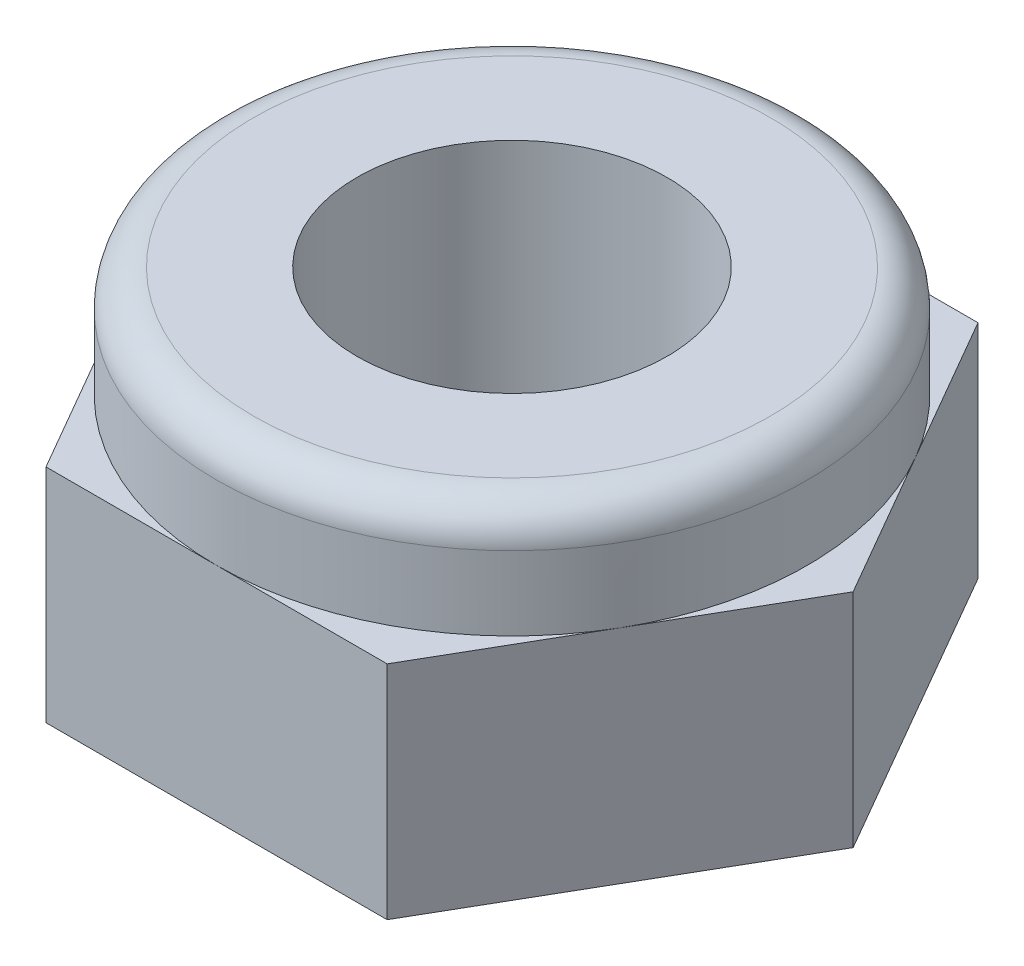
ISO-10303-21;
HEADER;
FILE_DESCRIPTION(('STEP AP214'),'2;1');
FILE_NAME('part.step','',(''),(''),'','','');
FILE_SCHEMA(('AUTOMOTIVE_DESIGN { 1 0 10303 214 1 1 1 1 }'));
ENDSEC;
DATA;
#1=APPLICATION_CONTEXT('core data for automotive mechanical design processes');
#2=APPLICATION_PROTOCOL_DEFINITION('international standard','automotive_design',2000,#1);
#3=PRODUCT_CONTEXT('',#1,'mechanical');
#4=PRODUCT('Part','Part','',(#3));
#5=PRODUCT_RELATED_PRODUCT_CATEGORY('part','',(#4));
#6=PRODUCT_DEFINITION_FORMATION('','',#4);
#7=PRODUCT_DEFINITION_CONTEXT('part definition',#1,'design');
#8=PRODUCT_DEFINITION('design','',#6,#7);
#9=PRODUCT_DEFINITION_SHAPE('','',#8);
#10=(LENGTH_UNIT() NAMED_UNIT(*) SI_UNIT(.MILLI.,.METRE.));
#11=(NAMED_UNIT(*) PLANE_ANGLE_UNIT() SI_UNIT($,.RADIAN.));
#12=(NAMED_UNIT(*) SI_UNIT($,.STERADIAN.) SOLID_ANGLE_UNIT());
#13=UNCERTAINTY_MEASURE_WITH_UNIT(LENGTH_MEASURE(1.E-05),#10,'distance_accuracy_value','');
#14=(GEOMETRIC_REPRESENTATION_CONTEXT(3) GLOBAL_UNCERTAINTY_ASSIGNED_CONTEXT((#13)) GLOBAL_UNIT_ASSIGNED_CONTEXT((#10,
#11,#12)) REPRESENTATION_CONTEXT('',''));
#15=CARTESIAN_POINT('',(0.,0.,0.));
#16=DIRECTION('',(0.,0.,1.));
#17=DIRECTION('',(1.,0.,0.));
#18=AXIS2_PLACEMENT_3D('',#15,#16,#17);
#19=CARTESIAN_POINT('',(0.,3.,0.));
#20=DIRECTION('',(0.,1.,0.));
#21=DIRECTION('',(0.,0.,1.));
#22=AXIS2_PLACEMENT_3D('',#19,#20,#21);
#23=PLANE('',#22);
#24=CARTESIAN_POINT('',(0.,3.,0.));
#25=DIRECTION('',(0.,1.,0.));
#26=DIRECTION('',(0.,0.,1.));
#27=AXIS2_PLACEMENT_3D('',#24,#25,#26);
#28=CIRCLE('',#27,4.);
#29=CARTESIAN_POINT('',(0.,3.,4.));
#30=VERTEX_POINT('',#29);
#31=CARTESIAN_POINT('',(3.46410161513777,3.,1.99999999999998));
#32=VERTEX_POINT('',#31);
#33=EDGE_CURVE('E126',#30,#32,#28,.T.);
#34=ORIENTED_EDGE('',*,*,#33,.F.);
#35=DIRECTION('',(1.,0.,0.));
#36=VECTOR('',#35,1.);
#37=CARTESIAN_POINT('',(-2.30940107675846,3.,4.00000000000001));
#38=LINE('',#37,#36);
#39=CARTESIAN_POINT('',(2.30940107675854,3.,3.99999999999996));
#40=VERTEX_POINT('',#39);
#41=EDGE_CURVE('E115',#30,#40,#38,.T.);
#42=ORIENTED_EDGE('',*,*,#41,.T.);
#43=DIRECTION('',(0.499999999999995,0.,-0.866025403784441));
#44=VECTOR('',#43,1.);
#45=CARTESIAN_POINT('',(2.30940107675854,3.,3.99999999999996));
#46=LINE('',#45,#44);
#47=EDGE_CURVE('E127',#40,#32,#46,.T.);
#48=ORIENTED_EDGE('',*,*,#47,.T.);
#49=EDGE_LOOP('',(#34,#42,#48));
#50=FACE_BOUND('',#49,.T.);
#51=ADVANCED_FACE('F37',(#50),#23,.T.);
#52=CARTESIAN_POINT('',(3.46410161513774,3.,-2.));
#53=VERTEX_POINT('',#52);
#54=EDGE_CURVE('E133',#32,#53,#28,.T.);
#55=ORIENTED_EDGE('',*,*,#54,.F.);
#56=CARTESIAN_POINT('',(4.61880215351699,3.,0.));
#57=VERTEX_POINT('',#56);
#58=EDGE_CURVE('E146',#32,#57,#46,.T.);
#59=ORIENTED_EDGE('',*,*,#58,.T.);
#60=DIRECTION('',(-0.500000000000001,0.,-0.866025403784438));
#61=VECTOR('',#60,1.);
#62=CARTESIAN_POINT('',(4.61880215351699,3.,0.));
#63=LINE('',#62,#61);
#64=EDGE_CURVE('E147',#57,#53,#63,.T.);
#65=ORIENTED_EDGE('',*,*,#64,.T.);
#66=EDGE_LOOP('',(#55,#59,#65));
#67=FACE_BOUND('',#66,.T.);
#68=ADVANCED_FACE('F227',(#67),#23,.T.);
#69=CARTESIAN_POINT('',(0.,3.,-3.99999999999998));
#70=VERTEX_POINT('',#69);
#71=EDGE_CURVE('E184',#53,#70,#28,.T.);
#72=ORIENTED_EDGE('',*,*,#71,.F.);
#73=CARTESIAN_POINT('',(2.30940107675849,3.,-3.99999999999999));
#74=VERTEX_POINT('',#73);
#75=EDGE_CURVE('E145',#53,#74,#63,.T.);
#76=ORIENTED_EDGE('',*,*,#75,.T.);
#77=DIRECTION('',(-1.,0.,0.));
#78=VECTOR('',#77,1.);
#79=CARTESIAN_POINT('',(2.30940107675849,3.,-3.99999999999999));
#80=LINE('',#79,#78);
#81=EDGE_CURVE('E151',#74,#70,#80,.T.);
#82=ORIENTED_EDGE('',*,*,#81,.T.);
#83=EDGE_LOOP('',(#72,#76,#82));
#84=FACE_BOUND('',#83,.T.);
#85=ADVANCED_FACE('F195',(#84),#23,.T.);
#86=CARTESIAN_POINT('',(-3.46410161513775,3.,-1.99999999999997));
#87=VERTEX_POINT('',#86);
#88=EDGE_CURVE('E137',#70,#87,#28,.T.);
#89=ORIENTED_EDGE('',*,*,#88,.F.);
#90=CARTESIAN_POINT('',(-2.30940107675851,3.,-3.99999999999998));
#91=VERTEX_POINT('',#90);
#92=EDGE_CURVE('E150',#70,#91,#80,.T.);
#93=ORIENTED_EDGE('',*,*,#92,.T.);
#94=DIRECTION('',(-0.499999999999995,0.,0.866025403784442));
#95=VECTOR('',#94,1.);
#96=CARTESIAN_POINT('',(-2.30940107675851,3.,-3.99999999999998));
#97=LINE('',#96,#95);
#98=EDGE_CURVE('E155',#91,#87,#97,.T.);
#99=ORIENTED_EDGE('',*,*,#98,.T.);
#100=EDGE_LOOP('',(#89,#93,#99));
#101=FACE_BOUND('',#100,.T.);
#102=ADVANCED_FACE('F188',(#101),#23,.T.);
#103=CARTESIAN_POINT('',(-3.46410161513772,3.,2.00000000000002));
#104=VERTEX_POINT('',#103);
#105=EDGE_CURVE('E60',#87,#104,#28,.T.);
#106=ORIENTED_EDGE('',*,*,#105,.F.);
#107=CARTESIAN_POINT('',(-4.61880215351699,3.,0.));
#108=VERTEX_POINT('',#107);
#109=EDGE_CURVE('E154',#87,#108,#97,.T.);
#110=ORIENTED_EDGE('',*,*,#109,.T.);
#111=DIRECTION('',(0.500000000000007,0.,0.866025403784435));
#112=VECTOR('',#111,1.);
#113=CARTESIAN_POINT('',(-4.61880215351699,3.,0.));
#114=LINE('',#113,#112);
#115=EDGE_CURVE('E124',#108,#104,#114,.T.);
#116=ORIENTED_EDGE('',*,*,#115,.T.);
#117=EDGE_LOOP('',(#106,#110,#116));
#118=FACE_BOUND('',#117,.T.);
#119=ADVANCED_FACE('F214',(#118),#23,.T.);
#120=CARTESIAN_POINT('',(2.30940107675854,3.,3.99999999999996));
#121=DIRECTION('',(-0.866025403784441,0.,-0.499999999999995));
#122=DIRECTION('',(-0.499999999999995,0.,0.866025403784442));
#123=AXIS2_PLACEMENT_3D('',#120,#121,#122);
#124=PLANE('',#123);
#125=DIRECTION('',(0.499999999999995,0.,-0.866025403784441));
#126=VECTOR('',#125,1.);
#127=CARTESIAN_POINT('',(2.30940107675854,0.,3.99999999999996));
#128=LINE('',#127,#126);
#129=CARTESIAN_POINT('',(2.30940107675854,0.,3.99999999999996));
#130=VERTEX_POINT('',#129);
#131=CARTESIAN_POINT('',(4.61880215351699,0.,0.));
#132=VERTEX_POINT('',#131);
#133=EDGE_CURVE('E130',#130,#132,#128,.T.);
#134=ORIENTED_EDGE('',*,*,#133,.T.);
#135=DIRECTION('',(0.,-1.,0.));
#136=VECTOR('',#135,1.);
#137=CARTESIAN_POINT('',(4.61880215351699,3.,0.));
#138=LINE('',#137,#136);
#139=EDGE_CURVE('E136',#57,#132,#138,.T.);
#140=ORIENTED_EDGE('',*,*,#139,.F.);
#141=ORIENTED_EDGE('',*,*,#58,.F.);
#142=ORIENTED_EDGE('',*,*,#47,.F.);
#143=DIRECTION('',(0.,-1.,0.));
#144=VECTOR('',#143,1.);
#145=CARTESIAN_POINT('',(2.30940107675854,3.,3.99999999999996));
#146=LINE('',#145,#144);
#147=EDGE_CURVE('E114',#40,#130,#146,.T.);
#148=ORIENTED_EDGE('',*,*,#147,.T.);
#149=EDGE_LOOP('',(#134,#140,#141,#142,#148));
#150=FACE_BOUND('',#149,.T.);
#151=ADVANCED_FACE('F216',(#150),#124,.F.);
#152=CARTESIAN_POINT('',(4.61880215351699,3.,0.));
#153=DIRECTION('',(-0.866025403784438,0.,0.500000000000001));
#154=DIRECTION('',(0.500000000000001,0.,0.866025403784438));
#155=AXIS2_PLACEMENT_3D('',#152,#153,#154);
#156=PLANE('',#155);
#157=DIRECTION('',(-0.500000000000001,0.,-0.866025403784438));
#158=VECTOR('',#157,1.);
#159=CARTESIAN_POINT('',(4.61880215351699,0.,0.));
#160=LINE('',#159,#158);
#161=CARTESIAN_POINT('',(2.30940107675849,0.,-3.99999999999999));
#162=VERTEX_POINT('',#161);
#163=EDGE_CURVE('E161',#132,#162,#160,.T.);
#164=ORIENTED_EDGE('',*,*,#163,.T.);
#165=DIRECTION('',(0.,-1.,0.));
#166=VECTOR('',#165,1.);
#167=CARTESIAN_POINT('',(2.30940107675849,3.,-3.99999999999999));
#168=LINE('',#167,#166);
#169=EDGE_CURVE('E139',#74,#162,#168,.T.);
#170=ORIENTED_EDGE('',*,*,#169,.F.);
#171=ORIENTED_EDGE('',*,*,#75,.F.);
#172=ORIENTED_EDGE('',*,*,#64,.F.);
#173=ORIENTED_EDGE('',*,*,#139,.T.);
#174=EDGE_LOOP('',(#164,#170,#171,#172,#173));
#175=FACE_BOUND('',#174,.T.);
#176=ADVANCED_FACE('F200',(#175),#156,.F.);
#177=CARTESIAN_POINT('',(2.30940107675849,3.,-3.99999999999999));
#178=DIRECTION('',(0.,0.,1.));
#179=DIRECTION('',(1.,0.,0.));
#180=AXIS2_PLACEMENT_3D('',#177,#178,#179);
#181=PLANE('',#180);
#182=DIRECTION('',(-1.,0.,0.));
#183=VECTOR('',#182,1.);
#184=CARTESIAN_POINT('',(2.30940107675849,0.,-3.99999999999999));
#185=LINE('',#184,#183);
#186=CARTESIAN_POINT('',(-2.30940107675851,0.,-3.99999999999998));
#187=VERTEX_POINT('',#186);
#188=EDGE_CURVE('E163',#162,#187,#185,.T.);
#189=ORIENTED_EDGE('',*,*,#188,.T.);
#190=DIRECTION('',(0.,-1.,0.));
#191=VECTOR('',#190,1.);
#192=CARTESIAN_POINT('',(-2.30940107675851,3.,-3.99999999999998));
#193=LINE('',#192,#191);
#194=EDGE_CURVE('E177',#91,#187,#193,.T.);
#195=ORIENTED_EDGE('',*,*,#194,.F.);
#196=ORIENTED_EDGE('',*,*,#92,.F.);
#197=ORIENTED_EDGE('',*,*,#81,.F.);
#198=ORIENTED_EDGE('',*,*,#169,.T.);
#199=EDGE_LOOP('',(#189,#195,#196,#197,#198));
#200=FACE_BOUND('',#199,.T.);
#201=ADVANCED_FACE('F193',(#200),#181,.F.);
#202=CARTESIAN_POINT('',(-2.30940107675851,3.,-3.99999999999998));
#203=DIRECTION('',(0.866025403784441,0.,0.499999999999995));
#204=DIRECTION('',(0.499999999999995,0.,-0.866025403784442));
#205=AXIS2_PLACEMENT_3D('',#202,#203,#204);
#206=PLANE('',#205);
#207=DIRECTION('',(-0.499999999999995,0.,0.866025403784442));
#208=VECTOR('',#207,1.);
#209=CARTESIAN_POINT('',(-2.30940107675851,0.,-3.99999999999998));
#210=LINE('',#209,#208);
#211=CARTESIAN_POINT('',(-4.61880215351699,0.,0.));
#212=VERTEX_POINT('',#211);
#213=EDGE_CURVE('E165',#187,#212,#210,.T.);
#214=ORIENTED_EDGE('',*,*,#213,.T.);
#215=DIRECTION('',(0.,-1.,0.));
#216=VECTOR('',#215,1.);
#217=CARTESIAN_POINT('',(-4.61880215351699,3.,0.));
#218=LINE('',#217,#216);
#219=EDGE_CURVE('E174',#108,#212,#218,.T.);
#220=ORIENTED_EDGE('',*,*,#219,.F.);
#221=ORIENTED_EDGE('',*,*,#109,.F.);
#222=ORIENTED_EDGE('',*,*,#98,.F.);
#223=ORIENTED_EDGE('',*,*,#194,.T.);
#224=EDGE_LOOP('',(#214,#220,#221,#222,#223));
#225=FACE_BOUND('',#224,.T.);
#226=ADVANCED_FACE('F210',(#225),#206,.F.);
#227=CARTESIAN_POINT('',(-4.61880215351699,3.,0.));
#228=DIRECTION('',(0.866025403784435,0.,-0.500000000000007));
#229=DIRECTION('',(-0.500000000000007,0.,-0.866025403784434));
#230=AXIS2_PLACEMENT_3D('',#227,#228,#229);
#231=PLANE('',#230);
#232=DIRECTION('',(0.500000000000007,0.,0.866025403784435));
#233=VECTOR('',#232,1.);
#234=CARTESIAN_POINT('',(-4.61880215351699,0.,0.));
#235=LINE('',#234,#233);
#236=CARTESIAN_POINT('',(-2.30940107675846,0.,4.00000000000001));
#237=VERTEX_POINT('',#236);
#238=EDGE_CURVE('E167',#212,#237,#235,.T.);
#239=ORIENTED_EDGE('',*,*,#238,.T.);
#240=DIRECTION('',(0.,-1.,0.));
#241=VECTOR('',#240,1.);
#242=CARTESIAN_POINT('',(-2.30940107675846,3.,4.00000000000001));
#243=LINE('',#242,#241);
#244=CARTESIAN_POINT('',(-2.30940107675846,3.,4.00000000000001));
#245=VERTEX_POINT('',#244);
#246=EDGE_CURVE('E172',#245,#237,#243,.T.);
#247=ORIENTED_EDGE('',*,*,#246,.F.);
#248=EDGE_CURVE('E110',#104,#245,#114,.T.);
#249=ORIENTED_EDGE('',*,*,#248,.F.);
#250=ORIENTED_EDGE('',*,*,#115,.F.);
#251=ORIENTED_EDGE('',*,*,#219,.T.);
#252=EDGE_LOOP('',(#239,#247,#249,#250,#251));
#253=FACE_BOUND('',#252,.T.);
#254=ADVANCED_FACE('F213',(#253),#231,.F.);
#255=CARTESIAN_POINT('',(-2.30940107675846,3.,4.00000000000001));
#256=DIRECTION('',(0.,0.,-1.));
#257=DIRECTION('',(-1.,0.,0.));
#258=AXIS2_PLACEMENT_3D('',#255,#256,#257);
#259=PLANE('',#258);
#260=DIRECTION('',(1.,0.,0.));
#261=VECTOR('',#260,1.);
#262=CARTESIAN_POINT('',(-2.30940107675846,0.,4.00000000000001));
#263=LINE('',#262,#261);
#264=EDGE_CURVE('E169',#237,#130,#263,.T.);
#265=ORIENTED_EDGE('',*,*,#264,.T.);
#266=ORIENTED_EDGE('',*,*,#147,.F.);
#267=ORIENTED_EDGE('',*,*,#41,.F.);
#268=EDGE_CURVE('E107',#245,#30,#38,.T.);
#269=ORIENTED_EDGE('',*,*,#268,.F.);
#270=ORIENTED_EDGE('',*,*,#246,.T.);
#271=EDGE_LOOP('',(#265,#266,#267,#269,#270));
#272=FACE_BOUND('',#271,.T.);
#273=ADVANCED_FACE('F119',(#272),#259,.F.);
#274=EDGE_CURVE('E52',#104,#30,#28,.T.);
#275=ORIENTED_EDGE('',*,*,#274,.F.);
#276=ORIENTED_EDGE('',*,*,#248,.T.);
#277=ORIENTED_EDGE('',*,*,#268,.T.);
#278=EDGE_LOOP('',(#275,#276,#277));
#279=FACE_BOUND('',#278,.T.);
#280=ADVANCED_FACE('F109',(#279),#23,.T.);
#281=CARTESIAN_POINT('',(0.,0.,0.));
#282=DIRECTION('',(0.,1.,0.));
#283=DIRECTION('',(0.,0.,1.));
#284=AXIS2_PLACEMENT_3D('',#281,#282,#283);
#285=PLANE('',#284);
#286=CARTESIAN_POINT('',(0.,0.,0.));
#287=DIRECTION('',(0.,1.,0.));
#288=DIRECTION('',(0.,0.,1.));
#289=AXIS2_PLACEMENT_3D('',#286,#287,#288);
#290=CIRCLE('',#289,2.09999999999999);
#291=CARTESIAN_POINT('',(0.,0.,2.09999999999999));
#292=VERTEX_POINT('',#291);
#293=EDGE_CURVE('E131',#292,#292,#290,.T.);
#294=ORIENTED_EDGE('',*,*,#293,.T.);
#295=EDGE_LOOP('',(#294));
#296=FACE_BOUND('',#295,.T.);
#297=ORIENTED_EDGE('',*,*,#133,.F.);
#298=ORIENTED_EDGE('',*,*,#264,.F.);
#299=ORIENTED_EDGE('',*,*,#238,.F.);
#300=ORIENTED_EDGE('',*,*,#213,.F.);
#301=ORIENTED_EDGE('',*,*,#188,.F.);
#302=ORIENTED_EDGE('',*,*,#163,.F.);
#303=EDGE_LOOP('',(#297,#298,#299,#300,#301,#302));
#304=FACE_BOUND('',#303,.T.);
#305=ADVANCED_FACE('F205',(#296,#304),#285,.F.);
#306=CARTESIAN_POINT('',(0.,4.5,0.));
#307=DIRECTION('',(0.,-1.,0.));
#308=DIRECTION('',(0.,0.,-1.));
#309=AXIS2_PLACEMENT_3D('',#306,#307,#308);
#310=CYLINDRICAL_SURFACE('',#309,4.);
#311=CARTESIAN_POINT('',(0.,4.,0.));
#312=DIRECTION('',(0.,1.,0.));
#313=DIRECTION('',(0.,0.,1.));
#314=AXIS2_PLACEMENT_3D('',#311,#312,#313);
#315=CIRCLE('',#314,4.);
#316=CARTESIAN_POINT('',(0.,4.,4.));
#317=VERTEX_POINT('',#316);
#318=EDGE_CURVE('E11',#317,#317,#315,.F.);
#319=ORIENTED_EDGE('',*,*,#318,.T.);
#320=EDGE_LOOP('',(#319));
#321=FACE_BOUND('',#320,.T.);
#322=ORIENTED_EDGE('',*,*,#33,.T.);
#323=ORIENTED_EDGE('',*,*,#54,.T.);
#324=ORIENTED_EDGE('',*,*,#71,.T.);
#325=ORIENTED_EDGE('',*,*,#88,.T.);
#326=ORIENTED_EDGE('',*,*,#105,.T.);
#327=ORIENTED_EDGE('',*,*,#274,.T.);
#328=EDGE_LOOP('',(#322,#323,#324,#325,#326,#327));
#329=FACE_BOUND('',#328,.T.);
#330=ADVANCED_FACE('F134',(#321,#329),#310,.T.);
#331=CARTESIAN_POINT('',(0.,4.5,0.));
#332=DIRECTION('',(0.,1.,0.));
#333=DIRECTION('',(0.,0.,1.));
#334=AXIS2_PLACEMENT_3D('',#331,#332,#333);
#335=PLANE('',#334);
#336=CARTESIAN_POINT('',(0.,4.5,0.));
#337=DIRECTION('',(0.,1.,0.));
#338=DIRECTION('',(0.,0.,1.));
#339=AXIS2_PLACEMENT_3D('',#336,#337,#338);
#340=CIRCLE('',#339,3.5);
#341=CARTESIAN_POINT('',(0.,4.5,3.5));
#342=VERTEX_POINT('',#341);
#343=EDGE_CURVE('E45',#342,#342,#340,.T.);
#344=ORIENTED_EDGE('',*,*,#343,.T.);
#345=EDGE_LOOP('',(#344));
#346=FACE_BOUND('',#345,.T.);
#347=CARTESIAN_POINT('',(0.,4.5,0.));
#348=DIRECTION('',(0.,1.,0.));
#349=DIRECTION('',(0.,0.,1.));
#350=AXIS2_PLACEMENT_3D('',#347,#348,#349);
#351=CIRCLE('',#350,2.09999999999999);
#352=CARTESIAN_POINT('',(0.,4.5,2.09999999999999));
#353=VERTEX_POINT('',#352);
#354=EDGE_CURVE('E360',#353,#353,#351,.T.);
#355=ORIENTED_EDGE('',*,*,#354,.F.);
#356=EDGE_LOOP('',(#355));
#357=FACE_BOUND('',#356,.T.);
#358=ADVANCED_FACE('F319',(#346,#357),#335,.T.);
#359=CARTESIAN_POINT('',(0.,4.5,0.));
#360=DIRECTION('',(0.,1.,0.));
#361=DIRECTION('',(0.,0.,1.));
#362=AXIS2_PLACEMENT_3D('',#359,#360,#361);
#363=CYLINDRICAL_SURFACE('',#362,2.09999999999999);
#364=ORIENTED_EDGE('',*,*,#293,.F.);
#365=EDGE_LOOP('',(#364));
#366=FACE_BOUND('',#365,.T.);
#367=ORIENTED_EDGE('',*,*,#354,.T.);
#368=EDGE_LOOP('',(#367));
#369=FACE_BOUND('',#368,.T.);
#370=ADVANCED_FACE('F313',(#366,#369),#363,.F.);
#371=CARTESIAN_POINT('',(0.,4.,0.));
#372=DIRECTION('',(0.,1.,0.));
#373=DIRECTION('',(0.,0.,1.));
#374=AXIS2_PLACEMENT_3D('',#371,#372,#373);
#375=TOROIDAL_SURFACE('',#374,3.5,0.5);
#376=ORIENTED_EDGE('',*,*,#318,.F.);
#377=EDGE_LOOP('',(#376));
#378=FACE_BOUND('',#377,.T.);
#379=ORIENTED_EDGE('',*,*,#343,.F.);
#380=EDGE_LOOP('',(#379));
#381=FACE_BOUND('',#380,.T.);
#382=ADVANCED_FACE('F39',(#378,#381),#375,.T.);
#383=CLOSED_SHELL('',(#51,#68,#85,#102,#119,#151,#176,#201,#226,#254,#273,#280,#305,#330,#358,
#370,#382));
#384=MANIFOLD_SOLID_BREP('B2',#383);
#385=ADVANCED_BREP_SHAPE_REPRESENTATION('',(#18,#384),#14);
#386=SHAPE_DEFINITION_REPRESENTATION(#9,#385);
ENDSEC;
END-ISO-10303-21;
